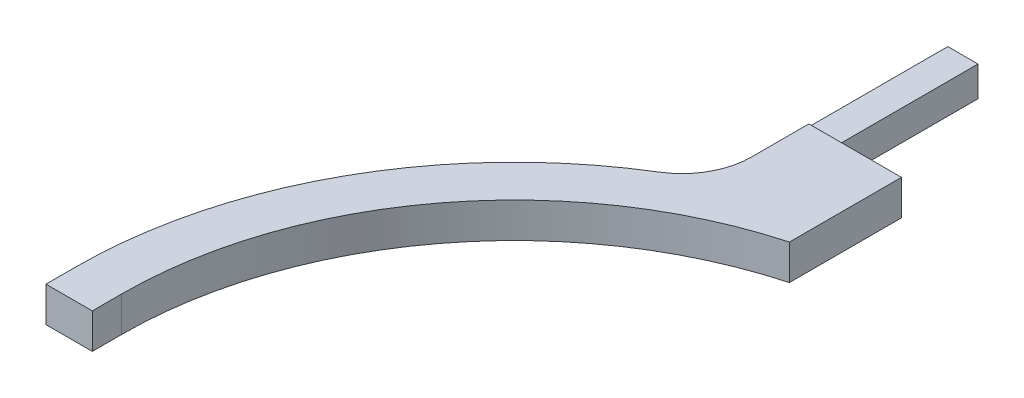
ISO-10303-21;
HEADER;
FILE_DESCRIPTION(('STEP AP214'),'2;1');
FILE_NAME('part.step','',(''),(''),'','','');
FILE_SCHEMA(('AUTOMOTIVE_DESIGN { 1 0 10303 214 1 1 1 1 }'));
ENDSEC;
DATA;
#1=APPLICATION_CONTEXT('core data for automotive mechanical design processes');
#2=APPLICATION_PROTOCOL_DEFINITION('international standard','automotive_design',2000,#1);
#3=PRODUCT_CONTEXT('',#1,'mechanical');
#4=PRODUCT('Part','Part','',(#3));
#5=PRODUCT_RELATED_PRODUCT_CATEGORY('part','',(#4));
#6=PRODUCT_DEFINITION_FORMATION('','',#4);
#7=PRODUCT_DEFINITION_CONTEXT('part definition',#1,'design');
#8=PRODUCT_DEFINITION('design','',#6,#7);
#9=PRODUCT_DEFINITION_SHAPE('','',#8);
#10=(LENGTH_UNIT() NAMED_UNIT(*) SI_UNIT(.MILLI.,.METRE.));
#11=(NAMED_UNIT(*) PLANE_ANGLE_UNIT() SI_UNIT($,.RADIAN.));
#12=(NAMED_UNIT(*) SI_UNIT($,.STERADIAN.) SOLID_ANGLE_UNIT());
#13=UNCERTAINTY_MEASURE_WITH_UNIT(LENGTH_MEASURE(1.E-05),#10,'distance_accuracy_value','');
#14=(GEOMETRIC_REPRESENTATION_CONTEXT(3) GLOBAL_UNCERTAINTY_ASSIGNED_CONTEXT((#13)) GLOBAL_UNIT_ASSIGNED_CONTEXT((#10,
#11,#12)) REPRESENTATION_CONTEXT('',''));
#15=CARTESIAN_POINT('',(0.,0.,0.));
#16=DIRECTION('',(0.,0.,1.));
#17=DIRECTION('',(1.,0.,0.));
#18=AXIS2_PLACEMENT_3D('',#15,#16,#17);
#19=CARTESIAN_POINT('',(0.,-15.16426412,0.));
#20=DIRECTION('',(0.,1.,0.));
#21=DIRECTION('',(0.,0.,-1.));
#22=AXIS2_PLACEMENT_3D('',#19,#20,#21);
#23=CYLINDRICAL_SURFACE('',#22,169.6);
#24=CARTESIAN_POINT('',(0.,0.,0.));
#25=DIRECTION('',(0.,1.,0.));
#26=DIRECTION('',(0.,0.,-1.));
#27=AXIS2_PLACEMENT_3D('',#24,#25,#26);
#28=CIRCLE('',#27,169.6);
#29=CARTESIAN_POINT('',(-44.8144999999997,0.,-163.572065432181));
#30=VERTEX_POINT('',#29);
#31=CARTESIAN_POINT('',(-169.6,0.,0.));
#32=VERTEX_POINT('',#31);
#33=EDGE_CURVE('E196',#30,#32,#28,.T.);
#34=ORIENTED_EDGE('',*,*,#33,.T.);
#35=DIRECTION('',(0.,1.,0.));
#36=VECTOR('',#35,1.);
#37=CARTESIAN_POINT('',(-169.6,-15.16426412,0.));
#38=LINE('',#37,#36);
#39=CARTESIAN_POINT('',(-169.6,-15.16426412,0.));
#40=VERTEX_POINT('',#39);
#41=EDGE_CURVE('E212',#40,#32,#38,.T.);
#42=ORIENTED_EDGE('',*,*,#41,.F.);
#43=CARTESIAN_POINT('',(0.,-15.16426412,0.));
#44=DIRECTION('',(0.,1.,0.));
#45=DIRECTION('',(0.,0.,-1.));
#46=AXIS2_PLACEMENT_3D('',#43,#44,#45);
#47=CIRCLE('',#46,169.6);
#48=CARTESIAN_POINT('',(-44.8144999999997,-15.16426412,-163.572065432181));
#49=VERTEX_POINT('',#48);
#50=EDGE_CURVE('E199',#49,#40,#47,.T.);
#51=ORIENTED_EDGE('',*,*,#50,.F.);
#52=DIRECTION('',(0.,1.,0.));
#53=VECTOR('',#52,1.);
#54=CARTESIAN_POINT('',(-44.8144999999997,-15.16426412,-163.572065432181));
#55=LINE('',#54,#53);
#56=EDGE_CURVE('E223',#49,#30,#55,.T.);
#57=ORIENTED_EDGE('',*,*,#56,.T.);
#58=EDGE_LOOP('',(#34,#42,#51,#57));
#59=FACE_BOUND('',#58,.T.);
#60=ADVANCED_FACE('F39',(#59),#23,.F.);
#61=CARTESIAN_POINT('',(-44.8144999999997,-15.16426412,-163.572065432181));
#62=DIRECTION('',(1.,0.,0.));
#63=DIRECTION('',(0.,0.,1.));
#64=AXIS2_PLACEMENT_3D('',#61,#62,#63);
#65=PLANE('',#64);
#66=DIRECTION('',(0.,0.,1.));
#67=VECTOR('',#66,1.);
#68=CARTESIAN_POINT('',(-44.8144999999997,0.,-163.572065432181));
#69=LINE('',#68,#67);
#70=CARTESIAN_POINT('',(-44.8144999999999,0.,-211.979244012939));
#71=VERTEX_POINT('',#70);
#72=EDGE_CURVE('E203',#71,#30,#69,.T.);
#73=ORIENTED_EDGE('',*,*,#72,.T.);
#74=ORIENTED_EDGE('',*,*,#56,.F.);
#75=DIRECTION('',(0.,0.,1.));
#76=VECTOR('',#75,1.);
#77=CARTESIAN_POINT('',(-44.8144999999997,-15.16426412,-163.572065432181));
#78=LINE('',#77,#76);
#79=CARTESIAN_POINT('',(-44.8144999999999,-15.16426412,-211.979244012939));
#80=VERTEX_POINT('',#79);
#81=EDGE_CURVE('E210',#80,#49,#78,.T.);
#82=ORIENTED_EDGE('',*,*,#81,.F.);
#83=DIRECTION('',(0.,1.,0.));
#84=VECTOR('',#83,1.);
#85=CARTESIAN_POINT('',(-44.8144999999999,-15.16426412,-211.979244012939));
#86=LINE('',#85,#84);
#87=EDGE_CURVE('E227',#80,#71,#86,.T.);
#88=ORIENTED_EDGE('',*,*,#87,.T.);
#89=EDGE_LOOP('',(#73,#74,#82,#88));
#90=FACE_BOUND('',#89,.T.);
#91=ADVANCED_FACE('F285',(#90),#65,.T.);
#92=CARTESIAN_POINT('',(-44.8144999999999,-15.16426412,-211.979244012939));
#93=DIRECTION('',(0.,0.,-1.));
#94=DIRECTION('',(1.,0.,0.));
#95=AXIS2_PLACEMENT_3D('',#92,#93,#94);
#96=PLANE('',#95);
#97=DIRECTION('',(-1.,0.,0.));
#98=VECTOR('',#97,1.);
#99=CARTESIAN_POINT('',(-84.8000000000001,-1.08213206,-211.979244012939));
#100=LINE('',#99,#98);
#101=CARTESIAN_POINT('',(-71.7600000000001,-1.08213206,-211.979244012939));
#102=VERTEX_POINT('',#101);
#103=CARTESIAN_POINT('',(-84.8000000000001,-1.08213206,-211.979244012939));
#104=VERTEX_POINT('',#103);
#105=EDGE_CURVE('E157',#102,#104,#100,.T.);
#106=ORIENTED_EDGE('',*,*,#105,.T.);
#107=DIRECTION('',(0.,1.,0.));
#108=VECTOR('',#107,1.);
#109=CARTESIAN_POINT('',(-84.8000000000001,-15.16426412,-211.979244012939));
#110=LINE('',#109,#108);
#111=CARTESIAN_POINT('',(-84.8000000000001,0.,-211.979244012939));
#112=VERTEX_POINT('',#111);
#113=EDGE_CURVE('E232',#104,#112,#110,.T.);
#114=ORIENTED_EDGE('',*,*,#113,.T.);
#115=DIRECTION('',(1.,0.,0.));
#116=VECTOR('',#115,1.);
#117=CARTESIAN_POINT('',(-44.8144999999999,0.,-211.979244012939));
#118=LINE('',#117,#116);
#119=EDGE_CURVE('E220',#112,#71,#118,.T.);
#120=ORIENTED_EDGE('',*,*,#119,.T.);
#121=ORIENTED_EDGE('',*,*,#87,.F.);
#122=DIRECTION('',(1.,0.,0.));
#123=VECTOR('',#122,1.);
#124=CARTESIAN_POINT('',(-44.8144999999999,-15.16426412,-211.979244012939));
#125=LINE('',#124,#123);
#126=CARTESIAN_POINT('',(-84.8000000000001,-15.16426412,-211.979244012939));
#127=VERTEX_POINT('',#126);
#128=EDGE_CURVE('E208',#127,#80,#125,.T.);
#129=ORIENTED_EDGE('',*,*,#128,.F.);
#130=CARTESIAN_POINT('',(-84.8000000000001,-14.08213206,-211.979244012939));
#131=VERTEX_POINT('',#130);
#132=EDGE_CURVE('E230',#127,#131,#110,.T.);
#133=ORIENTED_EDGE('',*,*,#132,.T.);
#134=DIRECTION('',(1.,0.,0.));
#135=VECTOR('',#134,1.);
#136=CARTESIAN_POINT('',(-84.8000000000001,-14.08213206,-211.979244012939));
#137=LINE('',#136,#135);
#138=CARTESIAN_POINT('',(-71.7600000000001,-14.08213206,-211.979244012939));
#139=VERTEX_POINT('',#138);
#140=EDGE_CURVE('E149',#131,#139,#137,.T.);
#141=ORIENTED_EDGE('',*,*,#140,.T.);
#142=DIRECTION('',(0.,1.,0.));
#143=VECTOR('',#142,1.);
#144=CARTESIAN_POINT('',(-71.7600000000001,-1.08213206,-211.979244012939));
#145=LINE('',#144,#143);
#146=EDGE_CURVE('E160',#139,#102,#145,.T.);
#147=ORIENTED_EDGE('',*,*,#146,.T.);
#148=EDGE_LOOP('',(#106,#114,#120,#121,#129,#133,#141,#147));
#149=FACE_BOUND('',#148,.T.);
#150=CARTESIAN_POINT('',(-64.80725,-7.58213206,-211.979244012939));
#151=DIRECTION('',(0.,0.,1.));
#152=DIRECTION('',(1.,0.,0.));
#153=AXIS2_PLACEMENT_3D('',#150,#151,#152);
#154=CIRCLE('',#153,4.505);
#155=CARTESIAN_POINT('',(-60.30225,-7.58213206,-211.979244012939));
#156=VERTEX_POINT('',#155);
#157=EDGE_CURVE('E192',#156,#156,#154,.T.);
#158=ORIENTED_EDGE('',*,*,#157,.T.);
#159=EDGE_LOOP('',(#158));
#160=FACE_BOUND('',#159,.T.);
#161=ADVANCED_FACE('F256',(#149,#160),#96,.T.);
#162=CARTESIAN_POINT('',(-84.8000000000001,-15.16426412,-169.579244012939));
#163=DIRECTION('',(-1.,0.,0.));
#164=DIRECTION('',(0.,0.,-1.));
#165=AXIS2_PLACEMENT_3D('',#162,#163,#164);
#166=PLANE('',#165);
#167=CARTESIAN_POINT('',(-84.8000000000001,-7.58213206,-231.979244012939));
#168=DIRECTION('',(1.,0.,0.));
#169=DIRECTION('',(0.,0.,-1.));
#170=AXIS2_PLACEMENT_3D('',#167,#168,#169);
#171=CIRCLE('',#170,1.5);
#172=CARTESIAN_POINT('',(-84.8000000000001,-7.58213206,-233.479244012939));
#173=VERTEX_POINT('',#172);
#174=EDGE_CURVE('E348',#173,#173,#171,.T.);
#175=ORIENTED_EDGE('',*,*,#174,.T.);
#176=EDGE_LOOP('',(#175));
#177=FACE_BOUND('',#176,.T.);
#178=CARTESIAN_POINT('',(-84.8000000000001,-7.58213206,-251.979244012939));
#179=DIRECTION('',(1.,0.,0.));
#180=DIRECTION('',(0.,0.,-1.));
#181=AXIS2_PLACEMENT_3D('',#178,#179,#180);
#182=CIRCLE('',#181,1.50000000000002);
#183=CARTESIAN_POINT('',(-84.8000000000001,-7.58213206,-253.479244012939));
#184=VERTEX_POINT('',#183);
#185=EDGE_CURVE('E351',#184,#184,#182,.T.);
#186=ORIENTED_EDGE('',*,*,#185,.T.);
#187=EDGE_LOOP('',(#186));
#188=FACE_BOUND('',#187,.T.);
#189=DIRECTION('',(0.,0.,-1.));
#190=VECTOR('',#189,1.);
#191=CARTESIAN_POINT('',(-84.8000000000001,0.,-169.579244012939));
#192=LINE('',#191,#190);
#193=CARTESIAN_POINT('',(-84.8000000000001,0.,-187.203418772201));
#194=VERTEX_POINT('',#193);
#195=EDGE_CURVE('E218',#194,#112,#192,.T.);
#196=ORIENTED_EDGE('',*,*,#195,.T.);
#197=ORIENTED_EDGE('',*,*,#113,.F.);
#198=DIRECTION('',(0.,0.,1.));
#199=VECTOR('',#198,1.);
#200=CARTESIAN_POINT('',(-84.8000000000001,-1.08213206,-271.979244012939));
#201=LINE('',#200,#199);
#202=CARTESIAN_POINT('',(-84.8000000000001,-1.08213206,-271.979244012939));
#203=VERTEX_POINT('',#202);
#204=EDGE_CURVE('E62',#203,#104,#201,.T.);
#205=ORIENTED_EDGE('',*,*,#204,.F.);
#206=DIRECTION('',(0.,-1.,0.));
#207=VECTOR('',#206,1.);
#208=CARTESIAN_POINT('',(-84.8000000000001,-1.08213206,-271.979244012939));
#209=LINE('',#208,#207);
#210=CARTESIAN_POINT('',(-84.8000000000001,-14.08213206,-271.979244012939));
#211=VERTEX_POINT('',#210);
#212=EDGE_CURVE('E140',#203,#211,#209,.T.);
#213=ORIENTED_EDGE('',*,*,#212,.T.);
#214=DIRECTION('',(0.,0.,1.));
#215=VECTOR('',#214,1.);
#216=CARTESIAN_POINT('',(-84.8000000000001,-14.08213206,-271.979244012939));
#217=LINE('',#216,#215);
#218=EDGE_CURVE('E146',#211,#131,#217,.T.);
#219=ORIENTED_EDGE('',*,*,#218,.T.);
#220=ORIENTED_EDGE('',*,*,#132,.F.);
#221=DIRECTION('',(0.,0.,-1.));
#222=VECTOR('',#221,1.);
#223=CARTESIAN_POINT('',(-84.8000000000001,-15.16426412,-169.579244012939));
#224=LINE('',#223,#222);
#225=CARTESIAN_POINT('',(-84.8000000000001,-15.16426412,-187.203418772201));
#226=VERTEX_POINT('',#225);
#227=EDGE_CURVE('E206',#226,#127,#224,.T.);
#228=ORIENTED_EDGE('',*,*,#227,.F.);
#229=DIRECTION('',(0.,-1.,0.));
#230=VECTOR('',#229,1.);
#231=CARTESIAN_POINT('',(-84.8000000000001,-15.16426412,-187.203418772201));
#232=LINE('',#231,#230);
#233=EDGE_CURVE('E240',#194,#226,#232,.T.);
#234=ORIENTED_EDGE('',*,*,#233,.F.);
#235=EDGE_LOOP('',(#196,#197,#205,#213,#219,#220,#228,#234));
#236=FACE_BOUND('',#235,.T.);
#237=ADVANCED_FACE('F156',(#177,#188,#236),#166,.T.);
#238=CARTESIAN_POINT('',(0.,-15.16426412,0.));
#239=DIRECTION('',(0.,1.,0.));
#240=DIRECTION('',(0.,0.,-1.));
#241=AXIS2_PLACEMENT_3D('',#238,#239,#240);
#242=CYLINDRICAL_SURFACE('',#241,189.6);
#243=CARTESIAN_POINT('',(0.,-15.16426412,0.));
#244=DIRECTION('',(0.,-1.,0.));
#245=DIRECTION('',(0.,0.,-1.));
#246=AXIS2_PLACEMENT_3D('',#243,#244,#245);
#247=CIRCLE('',#246,189.6);
#248=CARTESIAN_POINT('',(-189.6,-15.16426412,0.));
#249=VERTEX_POINT('',#248);
#250=CARTESIAN_POINT('',(-99.1169398907105,-15.16426412,-161.629181235015));
#251=VERTEX_POINT('',#250);
#252=EDGE_CURVE('E202',#249,#251,#247,.T.);
#253=ORIENTED_EDGE('',*,*,#252,.F.);
#254=DIRECTION('',(0.,1.,0.));
#255=VECTOR('',#254,1.);
#256=CARTESIAN_POINT('',(-189.6,-15.16426412,0.));
#257=LINE('',#256,#255);
#258=CARTESIAN_POINT('',(-189.6,0.,0.));
#259=VERTEX_POINT('',#258);
#260=EDGE_CURVE('E233',#249,#259,#257,.T.);
#261=ORIENTED_EDGE('',*,*,#260,.T.);
#262=CARTESIAN_POINT('',(0.,0.,0.));
#263=DIRECTION('',(0.,-1.,0.));
#264=DIRECTION('',(0.,0.,-1.));
#265=AXIS2_PLACEMENT_3D('',#262,#263,#264);
#266=CIRCLE('',#265,189.6);
#267=CARTESIAN_POINT('',(-99.1169398907105,0.,-161.629181235015));
#268=VERTEX_POINT('',#267);
#269=EDGE_CURVE('E215',#259,#268,#266,.T.);
#270=ORIENTED_EDGE('',*,*,#269,.T.);
#271=DIRECTION('',(0.,1.,0.));
#272=VECTOR('',#271,1.);
#273=CARTESIAN_POINT('',(-99.1169398907105,-15.16426412,-161.629181235015));
#274=LINE('',#273,#272);
#275=EDGE_CURVE('E226',#251,#268,#274,.T.);
#276=ORIENTED_EDGE('',*,*,#275,.F.);
#277=EDGE_LOOP('',(#253,#261,#270,#276));
#278=FACE_BOUND('',#277,.T.);
#279=ADVANCED_FACE('F267',(#278),#242,.T.);
#280=CARTESIAN_POINT('',(0.,-15.16426412,0.));
#281=DIRECTION('',(0.,1.,0.));
#282=DIRECTION('',(0.,0.,-1.));
#283=AXIS2_PLACEMENT_3D('',#280,#281,#282);
#284=PLANE('',#283);
#285=ORIENTED_EDGE('',*,*,#50,.T.);
#286=DIRECTION('',(0.,0.,-1.));
#287=VECTOR('',#286,1.);
#288=CARTESIAN_POINT('',(-169.6,-15.16426412,12.7));
#289=LINE('',#288,#287);
#290=CARTESIAN_POINT('',(-169.6,-15.16426412,12.7));
#291=VERTEX_POINT('',#290);
#292=EDGE_CURVE('E190',#291,#40,#289,.T.);
#293=ORIENTED_EDGE('',*,*,#292,.F.);
#294=DIRECTION('',(-1.,0.,0.));
#295=VECTOR('',#294,1.);
#296=CARTESIAN_POINT('',(-169.6,-15.16426412,12.7));
#297=LINE('',#296,#295);
#298=CARTESIAN_POINT('',(-189.6,-15.16426412,12.7));
#299=VERTEX_POINT('',#298);
#300=EDGE_CURVE('E176',#291,#299,#297,.T.);
#301=ORIENTED_EDGE('',*,*,#300,.T.);
#302=DIRECTION('',(0.,0.,-1.));
#303=VECTOR('',#302,1.);
#304=CARTESIAN_POINT('',(-189.6,-15.16426412,12.7));
#305=LINE('',#304,#303);
#306=EDGE_CURVE('E188',#299,#249,#305,.T.);
#307=ORIENTED_EDGE('',*,*,#306,.T.);
#308=ORIENTED_EDGE('',*,*,#252,.T.);
#309=CARTESIAN_POINT('',(-114.8,-15.16426412,-187.203418772201));
#310=DIRECTION('',(0.,-1.,0.));
#311=DIRECTION('',(0.,0.,-1.));
#312=AXIS2_PLACEMENT_3D('',#309,#310,#311);
#313=CIRCLE('',#312,30.);
#314=EDGE_CURVE('E11',#226,#251,#313,.T.);
#315=ORIENTED_EDGE('',*,*,#314,.F.);
#316=ORIENTED_EDGE('',*,*,#227,.T.);
#317=ORIENTED_EDGE('',*,*,#128,.T.);
#318=ORIENTED_EDGE('',*,*,#81,.T.);
#319=EDGE_LOOP('',(#285,#293,#301,#307,#308,#315,#316,#317,#318));
#320=FACE_BOUND('',#319,.T.);
#321=ADVANCED_FACE('F263',(#320),#284,.F.);
#322=CARTESIAN_POINT('',(0.,0.,0.));
#323=DIRECTION('',(0.,1.,0.));
#324=DIRECTION('',(0.,0.,-1.));
#325=AXIS2_PLACEMENT_3D('',#322,#323,#324);
#326=PLANE('',#325);
#327=ORIENTED_EDGE('',*,*,#33,.F.);
#328=ORIENTED_EDGE('',*,*,#72,.F.);
#329=ORIENTED_EDGE('',*,*,#119,.F.);
#330=ORIENTED_EDGE('',*,*,#195,.F.);
#331=CARTESIAN_POINT('',(-114.8,0.,-187.203418772201));
#332=DIRECTION('',(0.,-1.,0.));
#333=DIRECTION('',(0.,0.,-1.));
#334=AXIS2_PLACEMENT_3D('',#331,#332,#333);
#335=CIRCLE('',#334,30.);
#336=EDGE_CURVE('E47',#268,#194,#335,.F.);
#337=ORIENTED_EDGE('',*,*,#336,.F.);
#338=ORIENTED_EDGE('',*,*,#269,.F.);
#339=DIRECTION('',(0.,0.,-1.));
#340=VECTOR('',#339,1.);
#341=CARTESIAN_POINT('',(-189.6,0.,12.7));
#342=LINE('',#341,#340);
#343=CARTESIAN_POINT('',(-189.6,0.,12.7));
#344=VERTEX_POINT('',#343);
#345=EDGE_CURVE('E186',#344,#259,#342,.T.);
#346=ORIENTED_EDGE('',*,*,#345,.F.);
#347=DIRECTION('',(1.,0.,0.));
#348=VECTOR('',#347,1.);
#349=CARTESIAN_POINT('',(-169.6,0.,12.7));
#350=LINE('',#349,#348);
#351=CARTESIAN_POINT('',(-169.6,0.,12.7));
#352=VERTEX_POINT('',#351);
#353=EDGE_CURVE('E181',#344,#352,#350,.T.);
#354=ORIENTED_EDGE('',*,*,#353,.T.);
#355=DIRECTION('',(0.,0.,-1.));
#356=VECTOR('',#355,1.);
#357=CARTESIAN_POINT('',(-169.6,0.,12.7));
#358=LINE('',#357,#356);
#359=EDGE_CURVE('E184',#352,#32,#358,.T.);
#360=ORIENTED_EDGE('',*,*,#359,.T.);
#361=EDGE_LOOP('',(#327,#328,#329,#330,#337,#338,#346,#354,#360));
#362=FACE_BOUND('',#361,.T.);
#363=ADVANCED_FACE('F251',(#362),#326,.T.);
#364=CARTESIAN_POINT('',(-64.80725,-7.58213206,-181.979244012939));
#365=DIRECTION('',(0.,0.,-1.));
#366=DIRECTION('',(1.,0.,0.));
#367=AXIS2_PLACEMENT_3D('',#364,#365,#366);
#368=CYLINDRICAL_SURFACE('',#367,4.505);
#369=CARTESIAN_POINT('',(-64.80725,-7.58213206,-181.979244012939));
#370=DIRECTION('',(0.,0.,1.));
#371=DIRECTION('',(1.,0.,0.));
#372=AXIS2_PLACEMENT_3D('',#369,#370,#371);
#373=CIRCLE('',#372,4.505);
#374=CARTESIAN_POINT('',(-60.30225,-7.58213206,-181.979244012939));
#375=VERTEX_POINT('',#374);
#376=EDGE_CURVE('E193',#375,#375,#373,.T.);
#377=ORIENTED_EDGE('',*,*,#376,.T.);
#378=EDGE_LOOP('',(#377));
#379=FACE_BOUND('',#378,.T.);
#380=ORIENTED_EDGE('',*,*,#157,.F.);
#381=EDGE_LOOP('',(#380));
#382=FACE_BOUND('',#381,.T.);
#383=ADVANCED_FACE('F306',(#379,#382),#368,.F.);
#384=CARTESIAN_POINT('',(-64.80725,-7.58213206,-181.979244012939));
#385=DIRECTION('',(0.,0.,-1.));
#386=DIRECTION('',(1.,0.,0.));
#387=AXIS2_PLACEMENT_3D('',#384,#385,#386);
#388=PLANE('',#387);
#389=ORIENTED_EDGE('',*,*,#376,.F.);
#390=EDGE_LOOP('',(#389));
#391=FACE_BOUND('',#390,.T.);
#392=ADVANCED_FACE('F310',(#391),#388,.T.);
#393=CARTESIAN_POINT('',(-169.6,0.,12.7));
#394=DIRECTION('',(-1.,0.,0.));
#395=DIRECTION('',(0.,0.,-1.));
#396=AXIS2_PLACEMENT_3D('',#393,#394,#395);
#397=PLANE('',#396);
#398=ORIENTED_EDGE('',*,*,#41,.T.);
#399=ORIENTED_EDGE('',*,*,#359,.F.);
#400=DIRECTION('',(0.,-1.,0.));
#401=VECTOR('',#400,1.);
#402=CARTESIAN_POINT('',(-169.6,0.,12.7));
#403=LINE('',#402,#401);
#404=EDGE_CURVE('E153',#352,#291,#403,.T.);
#405=ORIENTED_EDGE('',*,*,#404,.T.);
#406=ORIENTED_EDGE('',*,*,#292,.T.);
#407=EDGE_LOOP('',(#398,#399,#405,#406));
#408=FACE_BOUND('',#407,.T.);
#409=ADVANCED_FACE('F280',(#408),#397,.F.);
#410=CARTESIAN_POINT('',(-189.6,0.,12.7));
#411=DIRECTION('',(1.,0.,0.));
#412=DIRECTION('',(0.,0.,1.));
#413=AXIS2_PLACEMENT_3D('',#410,#411,#412);
#414=PLANE('',#413);
#415=ORIENTED_EDGE('',*,*,#260,.F.);
#416=ORIENTED_EDGE('',*,*,#306,.F.);
#417=DIRECTION('',(0.,1.,0.));
#418=VECTOR('',#417,1.);
#419=CARTESIAN_POINT('',(-189.6,0.,12.7));
#420=LINE('',#419,#418);
#421=EDGE_CURVE('E179',#299,#344,#420,.T.);
#422=ORIENTED_EDGE('',*,*,#421,.T.);
#423=ORIENTED_EDGE('',*,*,#345,.T.);
#424=EDGE_LOOP('',(#415,#416,#422,#423));
#425=FACE_BOUND('',#424,.T.);
#426=ADVANCED_FACE('F272',(#425),#414,.F.);
#427=CARTESIAN_POINT('',(0.,0.,12.7));
#428=DIRECTION('',(0.,0.,1.));
#429=DIRECTION('',(-1.,0.,0.));
#430=AXIS2_PLACEMENT_3D('',#427,#428,#429);
#431=PLANE('',#430);
#432=ORIENTED_EDGE('',*,*,#404,.F.);
#433=ORIENTED_EDGE('',*,*,#353,.F.);
#434=ORIENTED_EDGE('',*,*,#421,.F.);
#435=ORIENTED_EDGE('',*,*,#300,.F.);
#436=EDGE_LOOP('',(#432,#433,#434,#435));
#437=FACE_BOUND('',#436,.T.);
#438=ADVANCED_FACE('F276',(#437),#431,.T.);
#439=CARTESIAN_POINT('',(-114.8,-15.16426412,-187.203418772201));
#440=DIRECTION('',(0.,1.,0.));
#441=DIRECTION('',(0.,0.,-1.));
#442=AXIS2_PLACEMENT_3D('',#439,#440,#441);
#443=CYLINDRICAL_SURFACE('',#442,30.);
#444=ORIENTED_EDGE('',*,*,#314,.T.);
#445=ORIENTED_EDGE('',*,*,#275,.T.);
#446=ORIENTED_EDGE('',*,*,#336,.T.);
#447=ORIENTED_EDGE('',*,*,#233,.T.);
#448=EDGE_LOOP('',(#444,#445,#446,#447));
#449=FACE_BOUND('',#448,.T.);
#450=ADVANCED_FACE('F41',(#449),#443,.F.);
#451=CARTESIAN_POINT('',(-84.8000000000001,-14.08213206,-271.979244012939));
#452=DIRECTION('',(0.,1.,0.));
#453=DIRECTION('',(0.,0.,-1.));
#454=AXIS2_PLACEMENT_3D('',#451,#452,#453);
#455=PLANE('',#454);
#456=ORIENTED_EDGE('',*,*,#140,.F.);
#457=ORIENTED_EDGE('',*,*,#218,.F.);
#458=DIRECTION('',(1.,0.,0.));
#459=VECTOR('',#458,1.);
#460=CARTESIAN_POINT('',(-84.8000000000001,-14.08213206,-271.979244012939));
#461=LINE('',#460,#459);
#462=CARTESIAN_POINT('',(-71.7600000000001,-14.08213206,-271.979244012939));
#463=VERTEX_POINT('',#462);
#464=EDGE_CURVE('E136',#211,#463,#461,.T.);
#465=ORIENTED_EDGE('',*,*,#464,.T.);
#466=DIRECTION('',(0.,0.,1.));
#467=VECTOR('',#466,1.);
#468=CARTESIAN_POINT('',(-71.7600000000001,-14.08213206,-271.979244012939));
#469=LINE('',#468,#467);
#470=EDGE_CURVE('E154',#463,#139,#469,.T.);
#471=ORIENTED_EDGE('',*,*,#470,.T.);
#472=EDGE_LOOP('',(#456,#457,#465,#471));
#473=FACE_BOUND('',#472,.T.);
#474=ADVANCED_FACE('F147',(#473),#455,.F.);
#475=CARTESIAN_POINT('',(-71.7600000000001,-1.08213206,-271.979244012939));
#476=DIRECTION('',(-1.,0.,0.));
#477=DIRECTION('',(0.,0.,-1.));
#478=AXIS2_PLACEMENT_3D('',#475,#476,#477);
#479=PLANE('',#478);
#480=ORIENTED_EDGE('',*,*,#146,.F.);
#481=ORIENTED_EDGE('',*,*,#470,.F.);
#482=DIRECTION('',(0.,1.,0.));
#483=VECTOR('',#482,1.);
#484=CARTESIAN_POINT('',(-71.7600000000001,-1.08213206,-271.979244012939));
#485=LINE('',#484,#483);
#486=CARTESIAN_POINT('',(-71.7600000000001,-1.08213206,-271.979244012939));
#487=VERTEX_POINT('',#486);
#488=EDGE_CURVE('E141',#463,#487,#485,.T.);
#489=ORIENTED_EDGE('',*,*,#488,.T.);
#490=DIRECTION('',(0.,0.,1.));
#491=VECTOR('',#490,1.);
#492=CARTESIAN_POINT('',(-71.7600000000001,-1.08213206,-271.979244012939));
#493=LINE('',#492,#491);
#494=EDGE_CURVE('E54',#487,#102,#493,.T.);
#495=ORIENTED_EDGE('',*,*,#494,.T.);
#496=EDGE_LOOP('',(#480,#481,#489,#495));
#497=FACE_BOUND('',#496,.T.);
#498=ADVANCED_FACE('F259',(#497),#479,.F.);
#499=CARTESIAN_POINT('',(-84.8000000000001,-1.08213206,-271.979244012939));
#500=DIRECTION('',(0.,-1.,0.));
#501=DIRECTION('',(0.,0.,1.));
#502=AXIS2_PLACEMENT_3D('',#499,#500,#501);
#503=PLANE('',#502);
#504=ORIENTED_EDGE('',*,*,#105,.F.);
#505=ORIENTED_EDGE('',*,*,#494,.F.);
#506=DIRECTION('',(-1.,0.,0.));
#507=VECTOR('',#506,1.);
#508=CARTESIAN_POINT('',(-84.8000000000001,-1.08213206,-271.979244012939));
#509=LINE('',#508,#507);
#510=EDGE_CURVE('E167',#487,#203,#509,.T.);
#511=ORIENTED_EDGE('',*,*,#510,.T.);
#512=ORIENTED_EDGE('',*,*,#204,.T.);
#513=EDGE_LOOP('',(#504,#505,#511,#512));
#514=FACE_BOUND('',#513,.T.);
#515=ADVANCED_FACE('F258',(#514),#503,.F.);
#516=CARTESIAN_POINT('',(0.,0.,-271.979244012939));
#517=DIRECTION('',(0.,0.,-1.));
#518=DIRECTION('',(1.,0.,0.));
#519=AXIS2_PLACEMENT_3D('',#516,#517,#518);
#520=PLANE('',#519);
#521=ORIENTED_EDGE('',*,*,#212,.F.);
#522=ORIENTED_EDGE('',*,*,#510,.F.);
#523=ORIENTED_EDGE('',*,*,#488,.F.);
#524=ORIENTED_EDGE('',*,*,#464,.F.);
#525=EDGE_LOOP('',(#521,#522,#523,#524));
#526=FACE_BOUND('',#525,.T.);
#527=ADVANCED_FACE('F138',(#526),#520,.T.);
#528=CARTESIAN_POINT('',(-74.8000000000001,-7.58213206,-251.979244012939));
#529=DIRECTION('',(-1.,0.,0.));
#530=DIRECTION('',(0.,0.,-1.));
#531=AXIS2_PLACEMENT_3D('',#528,#529,#530);
#532=CYLINDRICAL_SURFACE('',#531,1.50000000000002);
#533=CARTESIAN_POINT('',(-74.8000000000001,-7.58213206,-251.979244012939));
#534=DIRECTION('',(1.,0.,0.));
#535=DIRECTION('',(0.,0.,-1.));
#536=AXIS2_PLACEMENT_3D('',#533,#534,#535);
#537=CIRCLE('',#536,1.50000000000002);
#538=CARTESIAN_POINT('',(-74.8000000000001,-7.58213206,-253.479244012939));
#539=VERTEX_POINT('',#538);
#540=EDGE_CURVE('E163',#539,#539,#537,.T.);
#541=ORIENTED_EDGE('',*,*,#540,.T.);
#542=EDGE_LOOP('',(#541));
#543=FACE_BOUND('',#542,.T.);
#544=ORIENTED_EDGE('',*,*,#185,.F.);
#545=EDGE_LOOP('',(#544));
#546=FACE_BOUND('',#545,.T.);
#547=ADVANCED_FACE('F329',(#543,#546),#532,.F.);
#548=CARTESIAN_POINT('',(-74.8000000000001,-7.58213206,-251.979244012939));
#549=DIRECTION('',(-1.,0.,0.));
#550=DIRECTION('',(0.,0.,-1.));
#551=AXIS2_PLACEMENT_3D('',#548,#549,#550);
#552=PLANE('',#551);
#553=ORIENTED_EDGE('',*,*,#540,.F.);
#554=EDGE_LOOP('',(#553));
#555=FACE_BOUND('',#554,.T.);
#556=ADVANCED_FACE('F330',(#555),#552,.T.);
#557=CARTESIAN_POINT('',(-74.8000000000001,-7.58213206,-231.979244012939));
#558=DIRECTION('',(-1.,0.,0.));
#559=DIRECTION('',(0.,0.,-1.));
#560=AXIS2_PLACEMENT_3D('',#557,#558,#559);
#561=CYLINDRICAL_SURFACE('',#560,1.5);
#562=CARTESIAN_POINT('',(-74.8000000000001,-7.58213206,-231.979244012939));
#563=DIRECTION('',(1.,0.,0.));
#564=DIRECTION('',(0.,0.,-1.));
#565=AXIS2_PLACEMENT_3D('',#562,#563,#564);
#566=CIRCLE('',#565,1.5);
#567=CARTESIAN_POINT('',(-74.8000000000001,-7.58213206,-233.479244012939));
#568=VERTEX_POINT('',#567);
#569=EDGE_CURVE('E170',#568,#568,#566,.T.);
#570=ORIENTED_EDGE('',*,*,#569,.T.);
#571=EDGE_LOOP('',(#570));
#572=FACE_BOUND('',#571,.T.);
#573=ORIENTED_EDGE('',*,*,#174,.F.);
#574=EDGE_LOOP('',(#573));
#575=FACE_BOUND('',#574,.T.);
#576=ADVANCED_FACE('F333',(#572,#575),#561,.F.);
#577=CARTESIAN_POINT('',(-74.8000000000001,-7.58213206,-231.979244012939));
#578=DIRECTION('',(-1.,0.,0.));
#579=DIRECTION('',(0.,0.,-1.));
#580=AXIS2_PLACEMENT_3D('',#577,#578,#579);
#581=PLANE('',#580);
#582=ORIENTED_EDGE('',*,*,#569,.F.);
#583=EDGE_LOOP('',(#582));
#584=FACE_BOUND('',#583,.T.);
#585=ADVANCED_FACE('F340',(#584),#581,.T.);
#586=CLOSED_SHELL('',(#60,#91,#161,#237,#279,#321,#363,#383,#392,#409,#426,#438,#450,#474,#498,
#515,#527,#547,#556,#576,#585));
#587=MANIFOLD_SOLID_BREP('B2',#586);
#588=ADVANCED_BREP_SHAPE_REPRESENTATION('',(#18,#587),#14);
#589=SHAPE_DEFINITION_REPRESENTATION(#9,#588);
ENDSEC;
END-ISO-10303-21;
